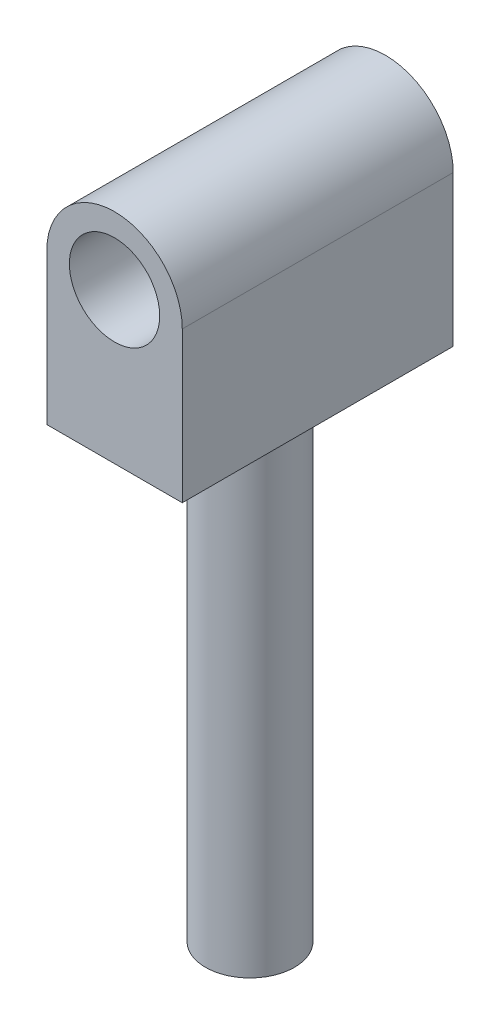
ISO-10303-21;
HEADER;
FILE_DESCRIPTION(('STEP AP214'),'2;1');
FILE_NAME('part.step','',(''),(''),'','','');
FILE_SCHEMA(('AUTOMOTIVE_DESIGN { 1 0 10303 214 1 1 1 1 }'));
ENDSEC;
DATA;
#1=APPLICATION_CONTEXT('core data for automotive mechanical design processes');
#2=APPLICATION_PROTOCOL_DEFINITION('international standard','automotive_design',2000,#1);
#3=PRODUCT_CONTEXT('',#1,'mechanical');
#4=PRODUCT('Part','Part','',(#3));
#5=PRODUCT_RELATED_PRODUCT_CATEGORY('part','',(#4));
#6=PRODUCT_DEFINITION_FORMATION('','',#4);
#7=PRODUCT_DEFINITION_CONTEXT('part definition',#1,'design');
#8=PRODUCT_DEFINITION('design','',#6,#7);
#9=PRODUCT_DEFINITION_SHAPE('','',#8);
#10=(LENGTH_UNIT() NAMED_UNIT(*) SI_UNIT(.MILLI.,.METRE.));
#11=(NAMED_UNIT(*) PLANE_ANGLE_UNIT() SI_UNIT($,.RADIAN.));
#12=(NAMED_UNIT(*) SI_UNIT($,.STERADIAN.) SOLID_ANGLE_UNIT());
#13=UNCERTAINTY_MEASURE_WITH_UNIT(LENGTH_MEASURE(1.E-05),#10,'distance_accuracy_value','');
#14=(GEOMETRIC_REPRESENTATION_CONTEXT(3) GLOBAL_UNCERTAINTY_ASSIGNED_CONTEXT((#13)) GLOBAL_UNIT_ASSIGNED_CONTEXT((#10,
#11,#12)) REPRESENTATION_CONTEXT('',''));
#15=CARTESIAN_POINT('',(0.,0.,0.));
#16=DIRECTION('',(0.,0.,1.));
#17=DIRECTION('',(1.,0.,0.));
#18=AXIS2_PLACEMENT_3D('',#15,#16,#17);
#19=CARTESIAN_POINT('',(0.,0.,45.72));
#20=DIRECTION('',(0.,0.,-1.));
#21=DIRECTION('',(-1.,0.,0.));
#22=AXIS2_PLACEMENT_3D('',#19,#20,#21);
#23=CYLINDRICAL_SURFACE('',#22,11.43);
#24=CARTESIAN_POINT('',(0.,0.,0.));
#25=DIRECTION('',(0.,0.,1.));
#26=DIRECTION('',(1.,0.,0.));
#27=AXIS2_PLACEMENT_3D('',#24,#25,#26);
#28=CIRCLE('',#27,11.43);
#29=CARTESIAN_POINT('',(11.43,0.,0.));
#30=VERTEX_POINT('',#29);
#31=CARTESIAN_POINT('',(-11.43,0.,0.));
#32=VERTEX_POINT('',#31);
#33=EDGE_CURVE('E106',#30,#32,#28,.T.);
#34=ORIENTED_EDGE('',*,*,#33,.T.);
#35=DIRECTION('',(0.,0.,-1.));
#36=VECTOR('',#35,1.);
#37=CARTESIAN_POINT('',(-11.43,0.,45.72));
#38=LINE('',#37,#36);
#39=CARTESIAN_POINT('',(-11.43,0.,45.72));
#40=VERTEX_POINT('',#39);
#41=EDGE_CURVE('E43',#40,#32,#38,.T.);
#42=ORIENTED_EDGE('',*,*,#41,.F.);
#43=CARTESIAN_POINT('',(0.,0.,45.72));
#44=DIRECTION('',(0.,0.,1.));
#45=DIRECTION('',(1.,0.,0.));
#46=AXIS2_PLACEMENT_3D('',#43,#44,#45);
#47=CIRCLE('',#46,11.43);
#48=CARTESIAN_POINT('',(11.43,0.,45.72));
#49=VERTEX_POINT('',#48);
#50=EDGE_CURVE('E93',#49,#40,#47,.T.);
#51=ORIENTED_EDGE('',*,*,#50,.F.);
#52=DIRECTION('',(0.,0.,-1.));
#53=VECTOR('',#52,1.);
#54=CARTESIAN_POINT('',(11.43,0.,45.72));
#55=LINE('',#54,#53);
#56=EDGE_CURVE('E102',#49,#30,#55,.T.);
#57=ORIENTED_EDGE('',*,*,#56,.T.);
#58=EDGE_LOOP('',(#34,#42,#51,#57));
#59=FACE_BOUND('',#58,.T.);
#60=ADVANCED_FACE('F40',(#59),#23,.T.);
#61=CARTESIAN_POINT('',(-11.43,0.,45.72));
#62=DIRECTION('',(1.,0.,0.));
#63=DIRECTION('',(0.,1.,0.));
#64=AXIS2_PLACEMENT_3D('',#61,#62,#63);
#65=PLANE('',#64);
#66=DIRECTION('',(0.,-1.,0.));
#67=VECTOR('',#66,1.);
#68=CARTESIAN_POINT('',(-11.43,0.,0.));
#69=LINE('',#68,#67);
#70=CARTESIAN_POINT('',(-11.43,-25.4,0.));
#71=VERTEX_POINT('',#70);
#72=EDGE_CURVE('E98',#32,#71,#69,.T.);
#73=ORIENTED_EDGE('',*,*,#72,.T.);
#74=DIRECTION('',(0.,0.,-1.));
#75=VECTOR('',#74,1.);
#76=CARTESIAN_POINT('',(-11.43,-25.4,45.72));
#77=LINE('',#76,#75);
#78=CARTESIAN_POINT('',(-11.43,-25.4,45.72));
#79=VERTEX_POINT('',#78);
#80=EDGE_CURVE('E96',#79,#71,#77,.T.);
#81=ORIENTED_EDGE('',*,*,#80,.F.);
#82=DIRECTION('',(0.,-1.,0.));
#83=VECTOR('',#82,1.);
#84=CARTESIAN_POINT('',(-11.43,0.,45.72));
#85=LINE('',#84,#83);
#86=EDGE_CURVE('E88',#40,#79,#85,.T.);
#87=ORIENTED_EDGE('',*,*,#86,.F.);
#88=ORIENTED_EDGE('',*,*,#41,.T.);
#89=EDGE_LOOP('',(#73,#81,#87,#88));
#90=FACE_BOUND('',#89,.T.);
#91=ADVANCED_FACE('F97',(#90),#65,.F.);
#92=CARTESIAN_POINT('',(11.43,-25.4,45.72));
#93=DIRECTION('',(0.,1.,0.));
#94=DIRECTION('',(0.,0.,1.));
#95=AXIS2_PLACEMENT_3D('',#92,#93,#94);
#96=PLANE('',#95);
#97=CARTESIAN_POINT('',(0.,-25.4,22.86));
#98=DIRECTION('',(0.,-1.,0.));
#99=DIRECTION('',(0.,0.,-1.));
#100=AXIS2_PLACEMENT_3D('',#97,#98,#99);
#101=CIRCLE('',#100,7.51406682282732);
#102=CARTESIAN_POINT('',(0.,-25.4,15.3459331771727));
#103=VERTEX_POINT('',#102);
#104=EDGE_CURVE('E11',#103,#103,#101,.T.);
#105=ORIENTED_EDGE('',*,*,#104,.F.);
#106=EDGE_LOOP('',(#105));
#107=FACE_BOUND('',#106,.T.);
#108=DIRECTION('',(1.,0.,0.));
#109=VECTOR('',#108,1.);
#110=CARTESIAN_POINT('',(11.43,-25.4,0.));
#111=LINE('',#110,#109);
#112=CARTESIAN_POINT('',(11.43,-25.4,0.));
#113=VERTEX_POINT('',#112);
#114=EDGE_CURVE('E74',#71,#113,#111,.T.);
#115=ORIENTED_EDGE('',*,*,#114,.T.);
#116=DIRECTION('',(0.,0.,-1.));
#117=VECTOR('',#116,1.);
#118=CARTESIAN_POINT('',(11.43,-25.4,45.72));
#119=LINE('',#118,#117);
#120=CARTESIAN_POINT('',(11.43,-25.4,45.72));
#121=VERTEX_POINT('',#120);
#122=EDGE_CURVE('E99',#121,#113,#119,.T.);
#123=ORIENTED_EDGE('',*,*,#122,.F.);
#124=DIRECTION('',(1.,0.,0.));
#125=VECTOR('',#124,1.);
#126=CARTESIAN_POINT('',(11.43,-25.4,45.72));
#127=LINE('',#126,#125);
#128=EDGE_CURVE('E91',#79,#121,#127,.T.);
#129=ORIENTED_EDGE('',*,*,#128,.F.);
#130=ORIENTED_EDGE('',*,*,#80,.T.);
#131=EDGE_LOOP('',(#115,#123,#129,#130));
#132=FACE_BOUND('',#131,.T.);
#133=ADVANCED_FACE('F100',(#107,#132),#96,.F.);
#134=CARTESIAN_POINT('',(11.43,0.,45.72));
#135=DIRECTION('',(-1.,0.,0.));
#136=DIRECTION('',(0.,0.,1.));
#137=AXIS2_PLACEMENT_3D('',#134,#135,#136);
#138=PLANE('',#137);
#139=DIRECTION('',(0.,1.,0.));
#140=VECTOR('',#139,1.);
#141=CARTESIAN_POINT('',(11.43,0.,0.));
#142=LINE('',#141,#140);
#143=EDGE_CURVE('E80',#113,#30,#142,.T.);
#144=ORIENTED_EDGE('',*,*,#143,.T.);
#145=ORIENTED_EDGE('',*,*,#56,.F.);
#146=DIRECTION('',(0.,1.,0.));
#147=VECTOR('',#146,1.);
#148=CARTESIAN_POINT('',(11.43,0.,45.72));
#149=LINE('',#148,#147);
#150=EDGE_CURVE('E57',#121,#49,#149,.T.);
#151=ORIENTED_EDGE('',*,*,#150,.F.);
#152=ORIENTED_EDGE('',*,*,#122,.T.);
#153=EDGE_LOOP('',(#144,#145,#151,#152));
#154=FACE_BOUND('',#153,.T.);
#155=ADVANCED_FACE('F114',(#154),#138,.F.);
#156=CARTESIAN_POINT('',(0.,0.,45.72));
#157=DIRECTION('',(0.,0.,1.));
#158=DIRECTION('',(1.,0.,0.));
#159=AXIS2_PLACEMENT_3D('',#156,#157,#158);
#160=PLANE('',#159);
#161=CARTESIAN_POINT('',(0.,0.,45.72));
#162=DIRECTION('',(0.,0.,1.));
#163=DIRECTION('',(1.,0.,0.));
#164=AXIS2_PLACEMENT_3D('',#161,#162,#163);
#165=CIRCLE('',#164,7.62);
#166=CARTESIAN_POINT('',(7.62,0.,45.72));
#167=VERTEX_POINT('',#166);
#168=EDGE_CURVE('E109',#167,#167,#165,.T.);
#169=ORIENTED_EDGE('',*,*,#168,.F.);
#170=EDGE_LOOP('',(#169));
#171=FACE_BOUND('',#170,.T.);
#172=ORIENTED_EDGE('',*,*,#50,.T.);
#173=ORIENTED_EDGE('',*,*,#86,.T.);
#174=ORIENTED_EDGE('',*,*,#128,.T.);
#175=ORIENTED_EDGE('',*,*,#150,.T.);
#176=EDGE_LOOP('',(#172,#173,#174,#175));
#177=FACE_BOUND('',#176,.T.);
#178=ADVANCED_FACE('F89',(#171,#177),#160,.T.);
#179=CARTESIAN_POINT('',(0.,0.,0.));
#180=DIRECTION('',(0.,0.,1.));
#181=DIRECTION('',(1.,0.,0.));
#182=AXIS2_PLACEMENT_3D('',#179,#180,#181);
#183=PLANE('',#182);
#184=CARTESIAN_POINT('',(0.,0.,0.));
#185=DIRECTION('',(0.,0.,1.));
#186=DIRECTION('',(1.,0.,0.));
#187=AXIS2_PLACEMENT_3D('',#184,#185,#186);
#188=CIRCLE('',#187,7.62);
#189=CARTESIAN_POINT('',(7.62,0.,0.));
#190=VERTEX_POINT('',#189);
#191=EDGE_CURVE('E122',#190,#190,#188,.T.);
#192=ORIENTED_EDGE('',*,*,#191,.T.);
#193=EDGE_LOOP('',(#192));
#194=FACE_BOUND('',#193,.T.);
#195=ORIENTED_EDGE('',*,*,#33,.F.);
#196=ORIENTED_EDGE('',*,*,#143,.F.);
#197=ORIENTED_EDGE('',*,*,#114,.F.);
#198=ORIENTED_EDGE('',*,*,#72,.F.);
#199=EDGE_LOOP('',(#195,#196,#197,#198));
#200=FACE_BOUND('',#199,.T.);
#201=ADVANCED_FACE('F117',(#194,#200),#183,.F.);
#202=CARTESIAN_POINT('',(0.,0.,35.306));
#203=DIRECTION('',(0.,0.,1.));
#204=DIRECTION('',(1.,0.,0.));
#205=AXIS2_PLACEMENT_3D('',#202,#203,#204);
#206=CYLINDRICAL_SURFACE('',#205,7.62);
#207=ORIENTED_EDGE('',*,*,#168,.T.);
#208=EDGE_LOOP('',(#207));
#209=FACE_BOUND('',#208,.T.);
#210=ORIENTED_EDGE('',*,*,#191,.F.);
#211=EDGE_LOOP('',(#210));
#212=FACE_BOUND('',#211,.T.);
#213=ADVANCED_FACE('F134',(#209,#212),#206,.F.);
#214=CARTESIAN_POINT('',(0.,-106.68,22.86));
#215=DIRECTION('',(0.,1.,0.));
#216=DIRECTION('',(0.,0.,1.));
#217=AXIS2_PLACEMENT_3D('',#214,#215,#216);
#218=CYLINDRICAL_SURFACE('',#217,7.51406682282732);
#219=CARTESIAN_POINT('',(0.,-106.68,22.86));
#220=DIRECTION('',(0.,-1.,0.));
#221=DIRECTION('',(0.,0.,-1.));
#222=AXIS2_PLACEMENT_3D('',#219,#220,#221);
#223=CIRCLE('',#222,7.51406682282732);
#224=CARTESIAN_POINT('',(0.,-106.68,15.3459331771727));
#225=VERTEX_POINT('',#224);
#226=EDGE_CURVE('E124',#225,#225,#223,.T.);
#227=ORIENTED_EDGE('',*,*,#226,.F.);
#228=EDGE_LOOP('',(#227));
#229=FACE_BOUND('',#228,.T.);
#230=ORIENTED_EDGE('',*,*,#104,.T.);
#231=EDGE_LOOP('',(#230));
#232=FACE_BOUND('',#231,.T.);
#233=ADVANCED_FACE('F131',(#229,#232),#218,.T.);
#234=CARTESIAN_POINT('',(0.,-106.68,0.));
#235=DIRECTION('',(0.,-1.,0.));
#236=DIRECTION('',(0.,0.,-1.));
#237=AXIS2_PLACEMENT_3D('',#234,#235,#236);
#238=PLANE('',#237);
#239=ORIENTED_EDGE('',*,*,#226,.T.);
#240=EDGE_LOOP('',(#239));
#241=FACE_BOUND('',#240,.T.);
#242=ADVANCED_FACE('F129',(#241),#238,.T.);
#243=CLOSED_SHELL('',(#60,#91,#133,#155,#178,#201,#213,#233,#242));
#244=MANIFOLD_SOLID_BREP('B2',#243);
#245=ADVANCED_BREP_SHAPE_REPRESENTATION('',(#18,#244),#14);
#246=SHAPE_DEFINITION_REPRESENTATION(#9,#245);
ENDSEC;
END-ISO-10303-21;
